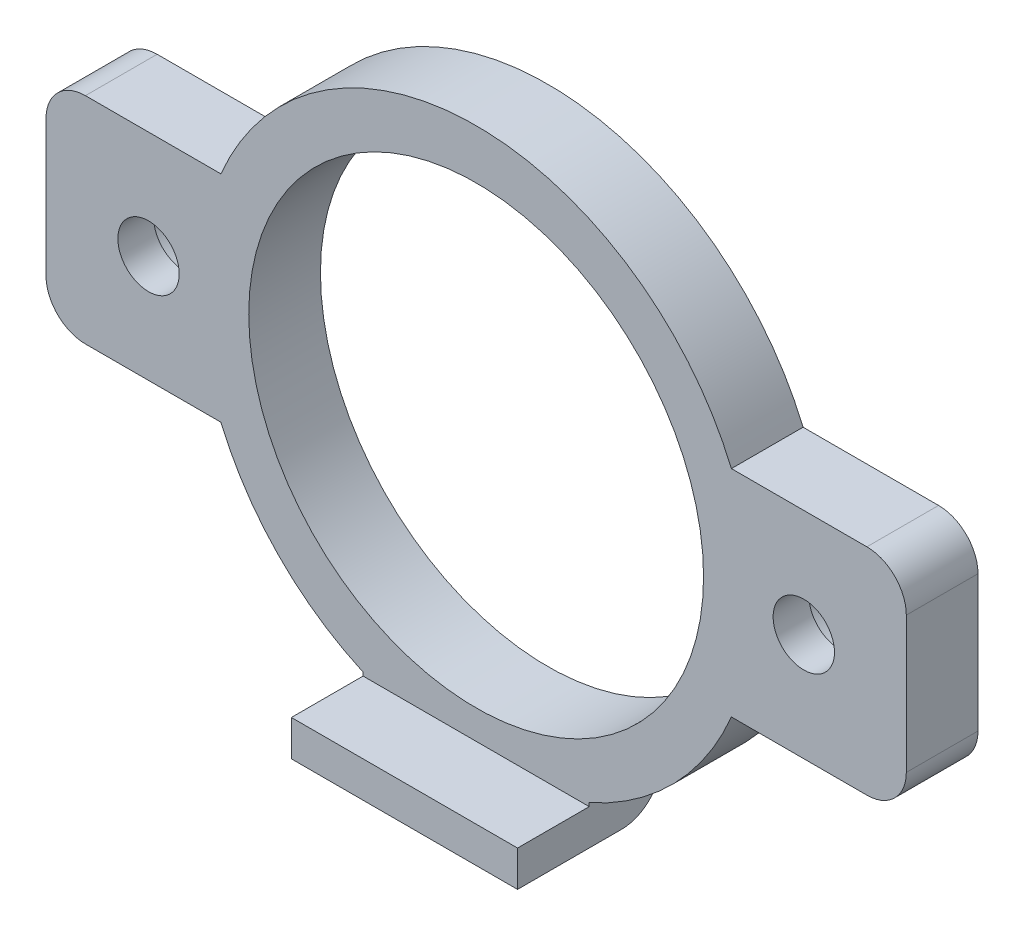
ISO-10303-21;
HEADER;
FILE_DESCRIPTION(('STEP AP214'),'2;1');
FILE_NAME('part.step','',(''),(''),'','','');
FILE_SCHEMA(('AUTOMOTIVE_DESIGN { 1 0 10303 214 1 1 1 1 }'));
ENDSEC;
DATA;
#1=APPLICATION_CONTEXT('core data for automotive mechanical design processes');
#2=APPLICATION_PROTOCOL_DEFINITION('international standard','automotive_design',2000,#1);
#3=PRODUCT_CONTEXT('',#1,'mechanical');
#4=PRODUCT('Part','Part','',(#3));
#5=PRODUCT_RELATED_PRODUCT_CATEGORY('part','',(#4));
#6=PRODUCT_DEFINITION_FORMATION('','',#4);
#7=PRODUCT_DEFINITION_CONTEXT('part definition',#1,'design');
#8=PRODUCT_DEFINITION('design','',#6,#7);
#9=PRODUCT_DEFINITION_SHAPE('','',#8);
#10=(LENGTH_UNIT() NAMED_UNIT(*) SI_UNIT(.MILLI.,.METRE.));
#11=(NAMED_UNIT(*) PLANE_ANGLE_UNIT() SI_UNIT($,.RADIAN.));
#12=(NAMED_UNIT(*) SI_UNIT($,.STERADIAN.) SOLID_ANGLE_UNIT());
#13=UNCERTAINTY_MEASURE_WITH_UNIT(LENGTH_MEASURE(1.E-05),#10,'distance_accuracy_value','');
#14=(GEOMETRIC_REPRESENTATION_CONTEXT(3) GLOBAL_UNCERTAINTY_ASSIGNED_CONTEXT((#13)) GLOBAL_UNIT_ASSIGNED_CONTEXT((#10,
#11,#12)) REPRESENTATION_CONTEXT('',''));
#15=CARTESIAN_POINT('',(0.,0.,0.));
#16=DIRECTION('',(0.,0.,1.));
#17=DIRECTION('',(1.,0.,0.));
#18=AXIS2_PLACEMENT_3D('',#15,#16,#17);
#19=CARTESIAN_POINT('',(0.,0.,0.));
#20=DIRECTION('',(0.,0.,1.));
#21=DIRECTION('',(1.,0.,0.));
#22=AXIS2_PLACEMENT_3D('',#19,#20,#21);
#23=PLANE('',#22);
#24=CARTESIAN_POINT('',(0.,0.,0.));
#25=DIRECTION('',(0.,0.,1.));
#26=DIRECTION('',(1.,0.,0.));
#27=AXIS2_PLACEMENT_3D('',#24,#25,#26);
#28=CIRCLE('',#27,6.34405594405594);
#29=CARTESIAN_POINT('',(6.34405594405594,0.,0.));
#30=VERTEX_POINT('',#29);
#31=EDGE_CURVE('E237',#30,#30,#28,.T.);
#32=ORIENTED_EDGE('',*,*,#31,.T.);
#33=EDGE_LOOP('',(#32));
#34=FACE_BOUND('',#33,.T.);
#35=DIRECTION('',(1.,0.,0.));
#36=VECTOR('',#35,1.);
#37=CARTESIAN_POINT('',(-12.,-3.,0.));
#38=LINE('',#37,#36);
#39=CARTESIAN_POINT('',(-10.9,-3.,0.));
#40=VERTEX_POINT('',#39);
#41=CARTESIAN_POINT('',(-7.1206643184094,-3.,0.));
#42=VERTEX_POINT('',#41);
#43=EDGE_CURVE('E315',#40,#42,#38,.T.);
#44=ORIENTED_EDGE('',*,*,#43,.F.);
#45=CARTESIAN_POINT('',(-10.9,-1.9,0.));
#46=DIRECTION('',(0.,0.,1.));
#47=DIRECTION('',(1.,0.,0.));
#48=AXIS2_PLACEMENT_3D('',#45,#46,#47);
#49=CIRCLE('',#48,1.1);
#50=CARTESIAN_POINT('',(-12.,-1.9,0.));
#51=VERTEX_POINT('',#50);
#52=EDGE_CURVE('E401',#40,#51,#49,.F.);
#53=ORIENTED_EDGE('',*,*,#52,.T.);
#54=DIRECTION('',(0.,-1.,0.));
#55=VECTOR('',#54,1.);
#56=CARTESIAN_POINT('',(-12.,3.,0.));
#57=LINE('',#56,#55);
#58=CARTESIAN_POINT('',(-12.,1.9,0.));
#59=VERTEX_POINT('',#58);
#60=EDGE_CURVE('E318',#59,#51,#57,.T.);
#61=ORIENTED_EDGE('',*,*,#60,.F.);
#62=CARTESIAN_POINT('',(-10.9,1.9,0.));
#63=DIRECTION('',(0.,0.,1.));
#64=DIRECTION('',(1.,0.,0.));
#65=AXIS2_PLACEMENT_3D('',#62,#63,#64);
#66=CIRCLE('',#65,1.1);
#67=CARTESIAN_POINT('',(-10.9,3.,0.));
#68=VERTEX_POINT('',#67);
#69=EDGE_CURVE('E398',#59,#68,#66,.F.);
#70=ORIENTED_EDGE('',*,*,#69,.T.);
#71=DIRECTION('',(1.,0.,0.));
#72=VECTOR('',#71,1.);
#73=CARTESIAN_POINT('',(-12.,3.,0.));
#74=LINE('',#73,#72);
#75=CARTESIAN_POINT('',(-7.1206643184094,3.,0.));
#76=VERTEX_POINT('',#75);
#77=EDGE_CURVE('E322',#68,#76,#74,.T.);
#78=ORIENTED_EDGE('',*,*,#77,.T.);
#79=CARTESIAN_POINT('',(0.,0.,0.));
#80=DIRECTION('',(0.,0.,1.));
#81=DIRECTION('',(1.,0.,0.));
#82=AXIS2_PLACEMENT_3D('',#79,#80,#81);
#83=CIRCLE('',#82,7.72682731368243);
#84=CARTESIAN_POINT('',(7.1206643184094,3.,0.));
#85=VERTEX_POINT('',#84);
#86=EDGE_CURVE('E325',#85,#76,#83,.T.);
#87=ORIENTED_EDGE('',*,*,#86,.F.);
#88=DIRECTION('',(-1.,0.,0.));
#89=VECTOR('',#88,1.);
#90=CARTESIAN_POINT('',(12.,3.,0.));
#91=LINE('',#90,#89);
#92=CARTESIAN_POINT('',(10.9,3.,0.));
#93=VERTEX_POINT('',#92);
#94=EDGE_CURVE('E329',#93,#85,#91,.T.);
#95=ORIENTED_EDGE('',*,*,#94,.F.);
#96=CARTESIAN_POINT('',(10.9,1.9,0.));
#97=DIRECTION('',(0.,0.,1.));
#98=DIRECTION('',(1.,0.,0.));
#99=AXIS2_PLACEMENT_3D('',#96,#97,#98);
#100=CIRCLE('',#99,1.1);
#101=CARTESIAN_POINT('',(12.,1.9,0.));
#102=VERTEX_POINT('',#101);
#103=EDGE_CURVE('E392',#93,#102,#100,.F.);
#104=ORIENTED_EDGE('',*,*,#103,.T.);
#105=DIRECTION('',(0.,-1.,0.));
#106=VECTOR('',#105,1.);
#107=CARTESIAN_POINT('',(12.,3.,0.));
#108=LINE('',#107,#106);
#109=CARTESIAN_POINT('',(12.,-1.9,0.));
#110=VERTEX_POINT('',#109);
#111=EDGE_CURVE('E332',#102,#110,#108,.T.);
#112=ORIENTED_EDGE('',*,*,#111,.T.);
#113=CARTESIAN_POINT('',(10.9,-1.9,0.));
#114=DIRECTION('',(0.,0.,1.));
#115=DIRECTION('',(1.,0.,0.));
#116=AXIS2_PLACEMENT_3D('',#113,#114,#115);
#117=CIRCLE('',#116,1.1);
#118=CARTESIAN_POINT('',(10.9,-3.,0.));
#119=VERTEX_POINT('',#118);
#120=EDGE_CURVE('E395',#110,#119,#117,.F.);
#121=ORIENTED_EDGE('',*,*,#120,.T.);
#122=DIRECTION('',(-1.,0.,0.));
#123=VECTOR('',#122,1.);
#124=CARTESIAN_POINT('',(12.,-3.,0.));
#125=LINE('',#124,#123);
#126=CARTESIAN_POINT('',(7.1206643184094,-3.,0.));
#127=VERTEX_POINT('',#126);
#128=EDGE_CURVE('E336',#119,#127,#125,.T.);
#129=ORIENTED_EDGE('',*,*,#128,.T.);
#130=CARTESIAN_POINT('',(0.,0.,0.));
#131=DIRECTION('',(0.,0.,1.));
#132=DIRECTION('',(1.,0.,0.));
#133=AXIS2_PLACEMENT_3D('',#130,#131,#132);
#134=CIRCLE('',#133,7.72682731368243);
#135=CARTESIAN_POINT('',(3.16249274077724,-7.05,0.));
#136=VERTEX_POINT('',#135);
#137=EDGE_CURVE('E339',#136,#127,#134,.T.);
#138=ORIENTED_EDGE('',*,*,#137,.F.);
#139=DIRECTION('',(-1.,0.,0.));
#140=VECTOR('',#139,1.);
#141=CARTESIAN_POINT('',(-3.15440313694085,-7.05,0.));
#142=LINE('',#141,#140);
#143=CARTESIAN_POINT('',(-3.16249274077724,-7.05,0.));
#144=VERTEX_POINT('',#143);
#145=EDGE_CURVE('E347',#136,#144,#142,.T.);
#146=ORIENTED_EDGE('',*,*,#145,.T.);
#147=CARTESIAN_POINT('',(0.,0.,0.));
#148=DIRECTION('',(0.,0.,1.));
#149=DIRECTION('',(1.,0.,0.));
#150=AXIS2_PLACEMENT_3D('',#147,#148,#149);
#151=CIRCLE('',#150,7.72682731368242);
#152=EDGE_CURVE('E311',#42,#144,#151,.T.);
#153=ORIENTED_EDGE('',*,*,#152,.F.);
#154=EDGE_LOOP('',(#44,#53,#61,#70,#78,#87,#95,#104,#112,#121,#129,#138,#146,#153));
#155=FACE_BOUND('',#154,.T.);
#156=CARTESIAN_POINT('',(-9.13997931467043,0.,0.));
#157=DIRECTION('',(0.,0.,1.));
#158=DIRECTION('',(1.,0.,0.));
#159=AXIS2_PLACEMENT_3D('',#156,#157,#158);
#160=CIRCLE('',#159,1.51048951048951);
#161=CARTESIAN_POINT('',(-7.62948980418092,0.,0.));
#162=VERTEX_POINT('',#161);
#163=EDGE_CURVE('E564',#162,#162,#160,.T.);
#164=ORIENTED_EDGE('',*,*,#163,.T.);
#165=EDGE_LOOP('',(#164));
#166=FACE_BOUND('',#165,.T.);
#167=CARTESIAN_POINT('',(9.13997931467043,0.,0.));
#168=DIRECTION('',(0.,0.,-1.));
#169=DIRECTION('',(-1.,0.,0.));
#170=AXIS2_PLACEMENT_3D('',#167,#168,#169);
#171=CIRCLE('',#170,1.51048951048951);
#172=CARTESIAN_POINT('',(7.62948980418092,0.,0.));
#173=VERTEX_POINT('',#172);
#174=EDGE_CURVE('E560',#173,#173,#171,.T.);
#175=ORIENTED_EDGE('',*,*,#174,.F.);
#176=EDGE_LOOP('',(#175));
#177=FACE_BOUND('',#176,.T.);
#178=ADVANCED_FACE('F80',(#34,#155,#166,#177),#23,.F.);
#179=CARTESIAN_POINT('',(9.13997931467043,0.,3.5));
#180=DIRECTION('',(0.,0.,-1.));
#181=DIRECTION('',(-1.,0.,0.));
#182=AXIS2_PLACEMENT_3D('',#179,#180,#181);
#183=CYLINDRICAL_SURFACE('',#182,0.855944055944055);
#184=CARTESIAN_POINT('',(9.13997931467043,0.,2.));
#185=DIRECTION('',(0.,0.,1.));
#186=DIRECTION('',(1.,0.,0.));
#187=AXIS2_PLACEMENT_3D('',#184,#185,#186);
#188=CIRCLE('',#187,0.855944055944055);
#189=CARTESIAN_POINT('',(9.99592337061449,0.,2.));
#190=VERTEX_POINT('',#189);
#191=EDGE_CURVE('E375',#190,#190,#188,.T.);
#192=ORIENTED_EDGE('',*,*,#191,.T.);
#193=EDGE_LOOP('',(#192));
#194=FACE_BOUND('',#193,.T.);
#195=CARTESIAN_POINT('',(9.13997931467043,0.,1.));
#196=DIRECTION('',(0.,0.,-1.));
#197=DIRECTION('',(-1.,0.,0.));
#198=AXIS2_PLACEMENT_3D('',#195,#196,#197);
#199=CIRCLE('',#198,0.855944055944055);
#200=CARTESIAN_POINT('',(8.28403525872638,0.,1.));
#201=VERTEX_POINT('',#200);
#202=EDGE_CURVE('E370',#201,#201,#199,.F.);
#203=ORIENTED_EDGE('',*,*,#202,.F.);
#204=EDGE_LOOP('',(#203));
#205=FACE_BOUND('',#204,.T.);
#206=ADVANCED_FACE('F511',(#194,#205),#183,.F.);
#207=CARTESIAN_POINT('',(0.,0.,2.));
#208=DIRECTION('',(0.,0.,1.));
#209=DIRECTION('',(1.,0.,0.));
#210=AXIS2_PLACEMENT_3D('',#207,#208,#209);
#211=PLANE('',#210);
#212=CARTESIAN_POINT('',(0.,0.,2.));
#213=DIRECTION('',(0.,0.,1.));
#214=DIRECTION('',(1.,0.,0.));
#215=AXIS2_PLACEMENT_3D('',#212,#213,#214);
#216=CIRCLE('',#215,6.34405594405594);
#217=CARTESIAN_POINT('',(6.34405594405594,0.,2.));
#218=VERTEX_POINT('',#217);
#219=EDGE_CURVE('E261',#218,#218,#216,.T.);
#220=ORIENTED_EDGE('',*,*,#219,.F.);
#221=EDGE_LOOP('',(#220));
#222=FACE_BOUND('',#221,.T.);
#223=DIRECTION('',(0.,-1.,0.));
#224=VECTOR('',#223,1.);
#225=CARTESIAN_POINT('',(-12.,3.,2.));
#226=LINE('',#225,#224);
#227=CARTESIAN_POINT('',(-12.,1.9,2.));
#228=VERTEX_POINT('',#227);
#229=CARTESIAN_POINT('',(-12.,-1.9,2.));
#230=VERTEX_POINT('',#229);
#231=EDGE_CURVE('E281',#228,#230,#226,.T.);
#232=ORIENTED_EDGE('',*,*,#231,.T.);
#233=CARTESIAN_POINT('',(-10.9,-1.9,2.));
#234=DIRECTION('',(0.,0.,1.));
#235=DIRECTION('',(1.,0.,0.));
#236=AXIS2_PLACEMENT_3D('',#233,#234,#235);
#237=CIRCLE('',#236,1.1);
#238=CARTESIAN_POINT('',(-10.9,-3.,2.));
#239=VERTEX_POINT('',#238);
#240=EDGE_CURVE('E419',#230,#239,#237,.T.);
#241=ORIENTED_EDGE('',*,*,#240,.T.);
#242=DIRECTION('',(1.,0.,0.));
#243=VECTOR('',#242,1.);
#244=CARTESIAN_POINT('',(-12.,-3.,2.));
#245=LINE('',#244,#243);
#246=CARTESIAN_POINT('',(-7.1206643184094,-3.,2.));
#247=VERTEX_POINT('',#246);
#248=EDGE_CURVE('E278',#239,#247,#245,.T.);
#249=ORIENTED_EDGE('',*,*,#248,.T.);
#250=CARTESIAN_POINT('',(0.,0.,2.));
#251=DIRECTION('',(0.,0.,1.));
#252=DIRECTION('',(1.,0.,0.));
#253=AXIS2_PLACEMENT_3D('',#250,#251,#252);
#254=CIRCLE('',#253,7.72682731368242);
#255=CARTESIAN_POINT('',(-3.15440313694085,-7.05362326645863,2.));
#256=VERTEX_POINT('',#255);
#257=EDGE_CURVE('E275',#247,#256,#254,.T.);
#258=ORIENTED_EDGE('',*,*,#257,.T.);
#259=DIRECTION('',(0.,-1.,0.));
#260=VECTOR('',#259,1.);
#261=CARTESIAN_POINT('',(-3.15440313694085,-7.05362326645863,2.));
#262=LINE('',#261,#260);
#263=CARTESIAN_POINT('',(-3.15440313694085,-7.15,2.));
#264=VERTEX_POINT('',#263);
#265=EDGE_CURVE('E271',#256,#264,#262,.T.);
#266=ORIENTED_EDGE('',*,*,#265,.T.);
#267=DIRECTION('',(-1.,0.,0.));
#268=VECTOR('',#267,1.);
#269=CARTESIAN_POINT('',(3.15440313694085,-7.15,2.));
#270=LINE('',#269,#268);
#271=CARTESIAN_POINT('',(3.15440313694085,-7.15,2.));
#272=VERTEX_POINT('',#271);
#273=EDGE_CURVE('E233',#272,#264,#270,.T.);
#274=ORIENTED_EDGE('',*,*,#273,.F.);
#275=DIRECTION('',(0.,-1.,0.));
#276=VECTOR('',#275,1.);
#277=CARTESIAN_POINT('',(3.15440313694085,-7.05362326645863,2.));
#278=LINE('',#277,#276);
#279=CARTESIAN_POINT('',(3.15440313694085,-7.05362326645863,2.));
#280=VERTEX_POINT('',#279);
#281=EDGE_CURVE('E306',#280,#272,#278,.T.);
#282=ORIENTED_EDGE('',*,*,#281,.F.);
#283=CARTESIAN_POINT('',(0.,0.,2.));
#284=DIRECTION('',(0.,0.,1.));
#285=DIRECTION('',(1.,0.,0.));
#286=AXIS2_PLACEMENT_3D('',#283,#284,#285);
#287=CIRCLE('',#286,7.72682731368243);
#288=CARTESIAN_POINT('',(7.1206643184094,-3.,2.));
#289=VERTEX_POINT('',#288);
#290=EDGE_CURVE('E302',#280,#289,#287,.T.);
#291=ORIENTED_EDGE('',*,*,#290,.T.);
#292=DIRECTION('',(-1.,0.,0.));
#293=VECTOR('',#292,1.);
#294=CARTESIAN_POINT('',(12.,-3.,2.));
#295=LINE('',#294,#293);
#296=CARTESIAN_POINT('',(10.9,-3.,2.));
#297=VERTEX_POINT('',#296);
#298=EDGE_CURVE('E299',#297,#289,#295,.T.);
#299=ORIENTED_EDGE('',*,*,#298,.F.);
#300=CARTESIAN_POINT('',(10.9,-1.9,2.));
#301=DIRECTION('',(0.,0.,1.));
#302=DIRECTION('',(1.,0.,0.));
#303=AXIS2_PLACEMENT_3D('',#300,#301,#302);
#304=CIRCLE('',#303,1.1);
#305=CARTESIAN_POINT('',(12.,-1.9,2.));
#306=VERTEX_POINT('',#305);
#307=EDGE_CURVE('E413',#297,#306,#304,.T.);
#308=ORIENTED_EDGE('',*,*,#307,.T.);
#309=DIRECTION('',(0.,-1.,0.));
#310=VECTOR('',#309,1.);
#311=CARTESIAN_POINT('',(12.,3.,2.));
#312=LINE('',#311,#310);
#313=CARTESIAN_POINT('',(12.,1.9,2.));
#314=VERTEX_POINT('',#313);
#315=EDGE_CURVE('E295',#314,#306,#312,.T.);
#316=ORIENTED_EDGE('',*,*,#315,.F.);
#317=CARTESIAN_POINT('',(10.9,1.9,2.));
#318=DIRECTION('',(0.,0.,1.));
#319=DIRECTION('',(1.,0.,0.));
#320=AXIS2_PLACEMENT_3D('',#317,#318,#319);
#321=CIRCLE('',#320,1.1);
#322=CARTESIAN_POINT('',(10.9,3.,2.));
#323=VERTEX_POINT('',#322);
#324=EDGE_CURVE('E104',#314,#323,#321,.T.);
#325=ORIENTED_EDGE('',*,*,#324,.T.);
#326=DIRECTION('',(-1.,0.,0.));
#327=VECTOR('',#326,1.);
#328=CARTESIAN_POINT('',(12.,3.,2.));
#329=LINE('',#328,#327);
#330=CARTESIAN_POINT('',(7.1206643184094,3.,2.));
#331=VERTEX_POINT('',#330);
#332=EDGE_CURVE('E292',#323,#331,#329,.T.);
#333=ORIENTED_EDGE('',*,*,#332,.T.);
#334=CARTESIAN_POINT('',(0.,0.,2.));
#335=DIRECTION('',(0.,0.,1.));
#336=DIRECTION('',(1.,0.,0.));
#337=AXIS2_PLACEMENT_3D('',#334,#335,#336);
#338=CIRCLE('',#337,7.72682731368243);
#339=CARTESIAN_POINT('',(-7.1206643184094,3.,2.));
#340=VERTEX_POINT('',#339);
#341=EDGE_CURVE('E288',#331,#340,#338,.T.);
#342=ORIENTED_EDGE('',*,*,#341,.T.);
#343=DIRECTION('',(1.,0.,0.));
#344=VECTOR('',#343,1.);
#345=CARTESIAN_POINT('',(-12.,3.,2.));
#346=LINE('',#345,#344);
#347=CARTESIAN_POINT('',(-10.9,3.,2.));
#348=VERTEX_POINT('',#347);
#349=EDGE_CURVE('E285',#348,#340,#346,.T.);
#350=ORIENTED_EDGE('',*,*,#349,.F.);
#351=CARTESIAN_POINT('',(-10.9,1.9,2.));
#352=DIRECTION('',(0.,0.,1.));
#353=DIRECTION('',(1.,0.,0.));
#354=AXIS2_PLACEMENT_3D('',#351,#352,#353);
#355=CIRCLE('',#354,1.1);
#356=EDGE_CURVE('E416',#348,#228,#355,.T.);
#357=ORIENTED_EDGE('',*,*,#356,.T.);
#358=EDGE_LOOP('',(#232,#241,#249,#258,#266,#274,#282,#291,#299,#308,#316,#325,#333,#342,#350,#357));
#359=FACE_BOUND('',#358,.T.);
#360=ORIENTED_EDGE('',*,*,#191,.F.);
#361=EDGE_LOOP('',(#360));
#362=FACE_BOUND('',#361,.T.);
#363=CARTESIAN_POINT('',(-9.13997931467043,0.,2.));
#364=DIRECTION('',(0.,0.,1.));
#365=DIRECTION('',(1.,0.,0.));
#366=AXIS2_PLACEMENT_3D('',#363,#364,#365);
#367=CIRCLE('',#366,0.855944055944055);
#368=CARTESIAN_POINT('',(-8.28403525872638,0.,2.));
#369=VERTEX_POINT('',#368);
#370=EDGE_CURVE('E227',#369,#369,#367,.F.);
#371=ORIENTED_EDGE('',*,*,#370,.T.);
#372=EDGE_LOOP('',(#371));
#373=FACE_BOUND('',#372,.T.);
#374=ADVANCED_FACE('F438',(#222,#359,#362,#373),#211,.T.);
#375=CARTESIAN_POINT('',(3.15440313694085,-7.05362326645863,2.));
#376=DIRECTION('',(1.,0.,0.));
#377=DIRECTION('',(0.,0.,-1.));
#378=AXIS2_PLACEMENT_3D('',#375,#376,#377);
#379=PLANE('',#378);
#380=DIRECTION('',(0.,0.,-1.));
#381=VECTOR('',#380,1.);
#382=CARTESIAN_POINT('',(3.15440313694085,-8.15,4.));
#383=LINE('',#382,#381);
#384=CARTESIAN_POINT('',(3.15440313694085,-8.15,4.));
#385=VERTEX_POINT('',#384);
#386=CARTESIAN_POINT('',(3.15440313694085,-8.15,1.1));
#387=VERTEX_POINT('',#386);
#388=EDGE_CURVE('E255',#385,#387,#383,.T.);
#389=ORIENTED_EDGE('',*,*,#388,.T.);
#390=CARTESIAN_POINT('',(3.15440313694085,-7.05,1.1));
#391=DIRECTION('',(1.,0.,0.));
#392=DIRECTION('',(0.,0.,-1.));
#393=AXIS2_PLACEMENT_3D('',#390,#391,#392);
#394=CIRCLE('',#393,1.1);
#395=CARTESIAN_POINT('',(3.15440313694085,-7.05362326645863,0.));
#396=VERTEX_POINT('',#395);
#397=EDGE_CURVE('E385',#387,#396,#394,.T.);
#398=ORIENTED_EDGE('',*,*,#397,.T.);
#399=DIRECTION('',(0.,0.,-1.));
#400=VECTOR('',#399,1.);
#401=CARTESIAN_POINT('',(3.15440313694085,-7.05362326645863,2.));
#402=LINE('',#401,#400);
#403=EDGE_CURVE('E343',#280,#396,#402,.T.);
#404=ORIENTED_EDGE('',*,*,#403,.F.);
#405=ORIENTED_EDGE('',*,*,#281,.T.);
#406=DIRECTION('',(0.,0.,-1.));
#407=VECTOR('',#406,1.);
#408=CARTESIAN_POINT('',(3.15440313694085,-7.15,4.));
#409=LINE('',#408,#407);
#410=CARTESIAN_POINT('',(3.15440313694085,-7.15,4.));
#411=VERTEX_POINT('',#410);
#412=EDGE_CURVE('E252',#411,#272,#409,.T.);
#413=ORIENTED_EDGE('',*,*,#412,.F.);
#414=DIRECTION('',(0.,-1.,0.));
#415=VECTOR('',#414,1.);
#416=CARTESIAN_POINT('',(3.15440313694085,-7.15,4.));
#417=LINE('',#416,#415);
#418=EDGE_CURVE('E223',#411,#385,#417,.T.);
#419=ORIENTED_EDGE('',*,*,#418,.T.);
#420=EDGE_LOOP('',(#389,#398,#404,#405,#413,#419));
#421=FACE_BOUND('',#420,.T.);
#422=ADVANCED_FACE('F496',(#421),#379,.T.);
#423=CARTESIAN_POINT('',(0.,0.,2.));
#424=DIRECTION('',(0.,0.,-1.));
#425=DIRECTION('',(-1.,0.,0.));
#426=AXIS2_PLACEMENT_3D('',#423,#424,#425);
#427=CYLINDRICAL_SURFACE('',#426,7.72682731368243);
#428=EDGE_CURVE('E272',#396,#136,#134,.T.);
#429=ORIENTED_EDGE('',*,*,#428,.T.);
#430=ORIENTED_EDGE('',*,*,#137,.T.);
#431=DIRECTION('',(0.,0.,-1.));
#432=VECTOR('',#431,1.);
#433=CARTESIAN_POINT('',(7.1206643184094,-3.,2.));
#434=LINE('',#433,#432);
#435=EDGE_CURVE('E348',#289,#127,#434,.T.);
#436=ORIENTED_EDGE('',*,*,#435,.F.);
#437=ORIENTED_EDGE('',*,*,#290,.F.);
#438=ORIENTED_EDGE('',*,*,#403,.T.);
#439=EDGE_LOOP('',(#429,#430,#436,#437,#438));
#440=FACE_BOUND('',#439,.T.);
#441=ADVANCED_FACE('F498',(#440),#427,.T.);
#442=CARTESIAN_POINT('',(12.,-3.,2.));
#443=DIRECTION('',(0.,-1.,0.));
#444=DIRECTION('',(1.,0.,0.));
#445=AXIS2_PLACEMENT_3D('',#442,#443,#444);
#446=PLANE('',#445);
#447=ORIENTED_EDGE('',*,*,#128,.F.);
#448=DIRECTION('',(0.,0.,-1.));
#449=VECTOR('',#448,1.);
#450=CARTESIAN_POINT('',(10.9,-3.,2.));
#451=LINE('',#450,#449);
#452=EDGE_CURVE('E89',#119,#297,#451,.F.);
#453=ORIENTED_EDGE('',*,*,#452,.T.);
#454=ORIENTED_EDGE('',*,*,#298,.T.);
#455=ORIENTED_EDGE('',*,*,#435,.T.);
#456=EDGE_LOOP('',(#447,#453,#454,#455));
#457=FACE_BOUND('',#456,.T.);
#458=ADVANCED_FACE('F435',(#457),#446,.T.);
#459=CARTESIAN_POINT('',(12.,3.,2.));
#460=DIRECTION('',(1.,0.,0.));
#461=DIRECTION('',(0.,0.,-1.));
#462=AXIS2_PLACEMENT_3D('',#459,#460,#461);
#463=PLANE('',#462);
#464=ORIENTED_EDGE('',*,*,#315,.T.);
#465=DIRECTION('',(0.,0.,-1.));
#466=VECTOR('',#465,1.);
#467=CARTESIAN_POINT('',(12.,-1.9,2.));
#468=LINE('',#467,#466);
#469=EDGE_CURVE('E427',#306,#110,#468,.T.);
#470=ORIENTED_EDGE('',*,*,#469,.T.);
#471=ORIENTED_EDGE('',*,*,#111,.F.);
#472=DIRECTION('',(0.,0.,-1.));
#473=VECTOR('',#472,1.);
#474=CARTESIAN_POINT('',(12.,1.9,2.));
#475=LINE('',#474,#473);
#476=EDGE_CURVE('E424',#102,#314,#475,.F.);
#477=ORIENTED_EDGE('',*,*,#476,.T.);
#478=EDGE_LOOP('',(#464,#470,#471,#477));
#479=FACE_BOUND('',#478,.T.);
#480=ADVANCED_FACE('F447',(#479),#463,.T.);
#481=CARTESIAN_POINT('',(12.,3.,2.));
#482=DIRECTION('',(0.,-1.,0.));
#483=DIRECTION('',(1.,0.,0.));
#484=AXIS2_PLACEMENT_3D('',#481,#482,#483);
#485=PLANE('',#484);
#486=ORIENTED_EDGE('',*,*,#332,.F.);
#487=DIRECTION('',(0.,0.,-1.));
#488=VECTOR('',#487,1.);
#489=CARTESIAN_POINT('',(10.9,3.,0.));
#490=LINE('',#489,#488);
#491=EDGE_CURVE('E12',#323,#93,#490,.T.);
#492=ORIENTED_EDGE('',*,*,#491,.T.);
#493=ORIENTED_EDGE('',*,*,#94,.T.);
#494=DIRECTION('',(0.,0.,-1.));
#495=VECTOR('',#494,1.);
#496=CARTESIAN_POINT('',(7.1206643184094,3.,2.));
#497=LINE('',#496,#495);
#498=EDGE_CURVE('E352',#331,#85,#497,.T.);
#499=ORIENTED_EDGE('',*,*,#498,.F.);
#500=EDGE_LOOP('',(#486,#492,#493,#499));
#501=FACE_BOUND('',#500,.T.);
#502=ADVANCED_FACE('F457',(#501),#485,.F.);
#503=CARTESIAN_POINT('',(0.,0.,2.));
#504=DIRECTION('',(0.,0.,-1.));
#505=DIRECTION('',(-1.,0.,0.));
#506=AXIS2_PLACEMENT_3D('',#503,#504,#505);
#507=CYLINDRICAL_SURFACE('',#506,7.72682731368243);
#508=ORIENTED_EDGE('',*,*,#86,.T.);
#509=DIRECTION('',(0.,0.,-1.));
#510=VECTOR('',#509,1.);
#511=CARTESIAN_POINT('',(-7.1206643184094,3.,2.));
#512=LINE('',#511,#510);
#513=EDGE_CURVE('E356',#340,#76,#512,.T.);
#514=ORIENTED_EDGE('',*,*,#513,.F.);
#515=ORIENTED_EDGE('',*,*,#341,.F.);
#516=ORIENTED_EDGE('',*,*,#498,.T.);
#517=EDGE_LOOP('',(#508,#514,#515,#516));
#518=FACE_BOUND('',#517,.T.);
#519=ADVANCED_FACE('F463',(#518),#507,.T.);
#520=CARTESIAN_POINT('',(-12.,3.,2.));
#521=DIRECTION('',(0.,1.,0.));
#522=DIRECTION('',(-1.,0.,0.));
#523=AXIS2_PLACEMENT_3D('',#520,#521,#522);
#524=PLANE('',#523);
#525=ORIENTED_EDGE('',*,*,#77,.F.);
#526=DIRECTION('',(0.,0.,-1.));
#527=VECTOR('',#526,1.);
#528=CARTESIAN_POINT('',(-10.9,3.,2.));
#529=LINE('',#528,#527);
#530=EDGE_CURVE('E96',#68,#348,#529,.F.);
#531=ORIENTED_EDGE('',*,*,#530,.T.);
#532=ORIENTED_EDGE('',*,*,#349,.T.);
#533=ORIENTED_EDGE('',*,*,#513,.T.);
#534=EDGE_LOOP('',(#525,#531,#532,#533));
#535=FACE_BOUND('',#534,.T.);
#536=ADVANCED_FACE('F464',(#535),#524,.T.);
#537=CARTESIAN_POINT('',(-12.,3.,2.));
#538=DIRECTION('',(1.,0.,0.));
#539=DIRECTION('',(0.,0.,-1.));
#540=AXIS2_PLACEMENT_3D('',#537,#538,#539);
#541=PLANE('',#540);
#542=ORIENTED_EDGE('',*,*,#60,.T.);
#543=DIRECTION('',(0.,0.,-1.));
#544=VECTOR('',#543,1.);
#545=CARTESIAN_POINT('',(-12.,-1.9,2.));
#546=LINE('',#545,#544);
#547=EDGE_CURVE('E408',#51,#230,#546,.F.);
#548=ORIENTED_EDGE('',*,*,#547,.T.);
#549=ORIENTED_EDGE('',*,*,#231,.F.);
#550=DIRECTION('',(0.,0.,-1.));
#551=VECTOR('',#550,1.);
#552=CARTESIAN_POINT('',(-12.,1.9,0.));
#553=LINE('',#552,#551);
#554=EDGE_CURVE('E404',#228,#59,#553,.T.);
#555=ORIENTED_EDGE('',*,*,#554,.T.);
#556=EDGE_LOOP('',(#542,#548,#549,#555));
#557=FACE_BOUND('',#556,.T.);
#558=ADVANCED_FACE('F471',(#557),#541,.F.);
#559=CARTESIAN_POINT('',(-12.,-3.,2.));
#560=DIRECTION('',(0.,1.,0.));
#561=DIRECTION('',(-1.,0.,0.));
#562=AXIS2_PLACEMENT_3D('',#559,#560,#561);
#563=PLANE('',#562);
#564=ORIENTED_EDGE('',*,*,#248,.F.);
#565=DIRECTION('',(0.,0.,-1.));
#566=VECTOR('',#565,1.);
#567=CARTESIAN_POINT('',(-10.9,-3.,2.));
#568=LINE('',#567,#566);
#569=EDGE_CURVE('E388',#239,#40,#568,.T.);
#570=ORIENTED_EDGE('',*,*,#569,.T.);
#571=ORIENTED_EDGE('',*,*,#43,.T.);
#572=DIRECTION('',(0.,0.,-1.));
#573=VECTOR('',#572,1.);
#574=CARTESIAN_POINT('',(-7.1206643184094,-3.,2.));
#575=LINE('',#574,#573);
#576=EDGE_CURVE('E360',#247,#42,#575,.T.);
#577=ORIENTED_EDGE('',*,*,#576,.F.);
#578=EDGE_LOOP('',(#564,#570,#571,#577));
#579=FACE_BOUND('',#578,.T.);
#580=ADVANCED_FACE('F480',(#579),#563,.F.);
#581=CARTESIAN_POINT('',(0.,0.,2.));
#582=DIRECTION('',(0.,0.,-1.));
#583=DIRECTION('',(-1.,0.,0.));
#584=AXIS2_PLACEMENT_3D('',#581,#582,#583);
#585=CYLINDRICAL_SURFACE('',#584,7.72682731368242);
#586=ORIENTED_EDGE('',*,*,#152,.T.);
#587=CARTESIAN_POINT('',(-3.15440313694085,-7.05362326645863,0.));
#588=VERTEX_POINT('',#587);
#589=EDGE_CURVE('E265',#144,#588,#151,.T.);
#590=ORIENTED_EDGE('',*,*,#589,.T.);
#591=DIRECTION('',(0.,0.,-1.));
#592=VECTOR('',#591,1.);
#593=CARTESIAN_POINT('',(-3.15440313694085,-7.05362326645863,2.));
#594=LINE('',#593,#592);
#595=EDGE_CURVE('E310',#256,#588,#594,.T.);
#596=ORIENTED_EDGE('',*,*,#595,.F.);
#597=ORIENTED_EDGE('',*,*,#257,.F.);
#598=ORIENTED_EDGE('',*,*,#576,.T.);
#599=EDGE_LOOP('',(#586,#590,#596,#597,#598));
#600=FACE_BOUND('',#599,.T.);
#601=ADVANCED_FACE('F485',(#600),#585,.T.);
#602=CARTESIAN_POINT('',(-3.15440313694085,-7.05362326645863,2.));
#603=DIRECTION('',(1.,0.,0.));
#604=DIRECTION('',(0.,0.,-1.));
#605=AXIS2_PLACEMENT_3D('',#602,#603,#604);
#606=PLANE('',#605);
#607=ORIENTED_EDGE('',*,*,#595,.T.);
#608=CARTESIAN_POINT('',(-3.15440313694085,-7.05,1.1));
#609=DIRECTION('',(1.,0.,0.));
#610=DIRECTION('',(0.,0.,-1.));
#611=AXIS2_PLACEMENT_3D('',#608,#609,#610);
#612=CIRCLE('',#611,1.1);
#613=CARTESIAN_POINT('',(-3.15440313694085,-8.15,1.1));
#614=VERTEX_POINT('',#613);
#615=EDGE_CURVE('E379',#588,#614,#612,.F.);
#616=ORIENTED_EDGE('',*,*,#615,.T.);
#617=DIRECTION('',(0.,0.,-1.));
#618=VECTOR('',#617,1.);
#619=CARTESIAN_POINT('',(-3.15440313694085,-8.15,4.));
#620=LINE('',#619,#618);
#621=CARTESIAN_POINT('',(-3.15440313694085,-8.15,4.));
#622=VERTEX_POINT('',#621);
#623=EDGE_CURVE('E238',#622,#614,#620,.T.);
#624=ORIENTED_EDGE('',*,*,#623,.F.);
#625=DIRECTION('',(0.,1.,0.));
#626=VECTOR('',#625,1.);
#627=CARTESIAN_POINT('',(-3.15440313694085,-8.15,4.));
#628=LINE('',#627,#626);
#629=CARTESIAN_POINT('',(-3.15440313694085,-7.15,4.));
#630=VERTEX_POINT('',#629);
#631=EDGE_CURVE('E220',#622,#630,#628,.T.);
#632=ORIENTED_EDGE('',*,*,#631,.T.);
#633=DIRECTION('',(0.,0.,-1.));
#634=VECTOR('',#633,1.);
#635=CARTESIAN_POINT('',(-3.15440313694085,-7.15,4.));
#636=LINE('',#635,#634);
#637=EDGE_CURVE('E231',#630,#264,#636,.T.);
#638=ORIENTED_EDGE('',*,*,#637,.T.);
#639=ORIENTED_EDGE('',*,*,#265,.F.);
#640=EDGE_LOOP('',(#607,#616,#624,#632,#638,#639));
#641=FACE_BOUND('',#640,.T.);
#642=ADVANCED_FACE('F241',(#641),#606,.F.);
#643=CARTESIAN_POINT('',(0.,0.,2.));
#644=DIRECTION('',(0.,0.,-1.));
#645=DIRECTION('',(-1.,0.,0.));
#646=AXIS2_PLACEMENT_3D('',#643,#644,#645);
#647=CYLINDRICAL_SURFACE('',#646,6.34405594405594);
#648=ORIENTED_EDGE('',*,*,#219,.T.);
#649=EDGE_LOOP('',(#648));
#650=FACE_BOUND('',#649,.T.);
#651=ORIENTED_EDGE('',*,*,#31,.F.);
#652=EDGE_LOOP('',(#651));
#653=FACE_BOUND('',#652,.T.);
#654=ADVANCED_FACE('F523',(#650,#653),#647,.F.);
#655=CARTESIAN_POINT('',(3.15440313694085,-7.15,4.));
#656=DIRECTION('',(0.,-1.,0.));
#657=DIRECTION('',(1.,0.,0.));
#658=AXIS2_PLACEMENT_3D('',#655,#656,#657);
#659=PLANE('',#658);
#660=ORIENTED_EDGE('',*,*,#412,.T.);
#661=ORIENTED_EDGE('',*,*,#273,.T.);
#662=ORIENTED_EDGE('',*,*,#637,.F.);
#663=DIRECTION('',(-1.,0.,0.));
#664=VECTOR('',#663,1.);
#665=CARTESIAN_POINT('',(3.15440313694085,-7.15,4.));
#666=LINE('',#665,#664);
#667=EDGE_CURVE('E215',#411,#630,#666,.T.);
#668=ORIENTED_EDGE('',*,*,#667,.F.);
#669=EDGE_LOOP('',(#660,#661,#662,#668));
#670=FACE_BOUND('',#669,.T.);
#671=ADVANCED_FACE('F232',(#670),#659,.F.);
#672=CARTESIAN_POINT('',(3.15440313694085,-8.15,4.));
#673=DIRECTION('',(0.,-1.,0.));
#674=DIRECTION('',(0.,0.,-1.));
#675=AXIS2_PLACEMENT_3D('',#672,#673,#674);
#676=PLANE('',#675);
#677=ORIENTED_EDGE('',*,*,#623,.T.);
#678=DIRECTION('',(-1.,0.,0.));
#679=VECTOR('',#678,1.);
#680=CARTESIAN_POINT('',(3.15440313694085,-8.15,1.1));
#681=LINE('',#680,#679);
#682=EDGE_CURVE('E382',#614,#387,#681,.F.);
#683=ORIENTED_EDGE('',*,*,#682,.T.);
#684=ORIENTED_EDGE('',*,*,#388,.F.);
#685=DIRECTION('',(-1.,0.,0.));
#686=VECTOR('',#685,1.);
#687=CARTESIAN_POINT('',(3.15440313694085,-8.15,4.));
#688=LINE('',#687,#686);
#689=EDGE_CURVE('E244',#385,#622,#688,.T.);
#690=ORIENTED_EDGE('',*,*,#689,.T.);
#691=EDGE_LOOP('',(#677,#683,#684,#690));
#692=FACE_BOUND('',#691,.T.);
#693=ADVANCED_FACE('F494',(#692),#676,.T.);
#694=CARTESIAN_POINT('',(0.,0.,4.));
#695=DIRECTION('',(0.,0.,-1.));
#696=DIRECTION('',(-1.,0.,0.));
#697=AXIS2_PLACEMENT_3D('',#694,#695,#696);
#698=PLANE('',#697);
#699=ORIENTED_EDGE('',*,*,#667,.T.);
#700=ORIENTED_EDGE('',*,*,#631,.F.);
#701=ORIENTED_EDGE('',*,*,#689,.F.);
#702=ORIENTED_EDGE('',*,*,#418,.F.);
#703=EDGE_LOOP('',(#699,#700,#701,#702));
#704=FACE_BOUND('',#703,.T.);
#705=ADVANCED_FACE('F217',(#704),#698,.F.);
#706=CARTESIAN_POINT('',(-9.13997931467043,0.,3.5));
#707=DIRECTION('',(0.,0.,-1.));
#708=DIRECTION('',(-1.,0.,0.));
#709=AXIS2_PLACEMENT_3D('',#706,#707,#708);
#710=CYLINDRICAL_SURFACE('',#709,0.855944055944055);
#711=CARTESIAN_POINT('',(-9.13997931467043,0.,1.));
#712=DIRECTION('',(0.,0.,1.));
#713=DIRECTION('',(1.,0.,0.));
#714=AXIS2_PLACEMENT_3D('',#711,#712,#713);
#715=CIRCLE('',#714,0.855944055944055);
#716=CARTESIAN_POINT('',(-8.28403525872638,0.,1.));
#717=VERTEX_POINT('',#716);
#718=EDGE_CURVE('E366',#717,#717,#715,.T.);
#719=ORIENTED_EDGE('',*,*,#718,.F.);
#720=EDGE_LOOP('',(#719));
#721=FACE_BOUND('',#720,.T.);
#722=ORIENTED_EDGE('',*,*,#370,.F.);
#723=EDGE_LOOP('',(#722));
#724=FACE_BOUND('',#723,.T.);
#725=ADVANCED_FACE('F532',(#721,#724),#710,.F.);
#726=CARTESIAN_POINT('',(-9.13997931467043,0.,1.));
#727=DIRECTION('',(0.,0.,-1.));
#728=DIRECTION('',(-1.,0.,0.));
#729=AXIS2_PLACEMENT_3D('',#726,#727,#728);
#730=CYLINDRICAL_SURFACE('',#729,1.51048951048951);
#731=CARTESIAN_POINT('',(-9.13997931467043,0.,1.));
#732=DIRECTION('',(0.,0.,1.));
#733=DIRECTION('',(1.,0.,0.));
#734=AXIS2_PLACEMENT_3D('',#731,#732,#733);
#735=CIRCLE('',#734,1.51048951048951);
#736=CARTESIAN_POINT('',(-7.62948980418092,0.,1.));
#737=VERTEX_POINT('',#736);
#738=EDGE_CURVE('E570',#737,#737,#735,.T.);
#739=ORIENTED_EDGE('',*,*,#738,.T.);
#740=EDGE_LOOP('',(#739));
#741=FACE_BOUND('',#740,.T.);
#742=ORIENTED_EDGE('',*,*,#163,.F.);
#743=EDGE_LOOP('',(#742));
#744=FACE_BOUND('',#743,.T.);
#745=ADVANCED_FACE('F536',(#741,#744),#730,.F.);
#746=CARTESIAN_POINT('',(-9.13997931467043,0.,1.));
#747=DIRECTION('',(0.,0.,1.));
#748=DIRECTION('',(1.,0.,0.));
#749=AXIS2_PLACEMENT_3D('',#746,#747,#748);
#750=PLANE('',#749);
#751=ORIENTED_EDGE('',*,*,#718,.T.);
#752=EDGE_LOOP('',(#751));
#753=FACE_BOUND('',#752,.T.);
#754=ORIENTED_EDGE('',*,*,#738,.F.);
#755=EDGE_LOOP('',(#754));
#756=FACE_BOUND('',#755,.T.);
#757=ADVANCED_FACE('F538',(#753,#756),#750,.F.);
#758=CARTESIAN_POINT('',(9.13997931467043,0.,1.));
#759=DIRECTION('',(0.,0.,-1.));
#760=DIRECTION('',(-1.,0.,0.));
#761=AXIS2_PLACEMENT_3D('',#758,#759,#760);
#762=PLANE('',#761);
#763=CARTESIAN_POINT('',(9.13997931467043,0.,1.));
#764=DIRECTION('',(0.,0.,-1.));
#765=DIRECTION('',(-1.,0.,0.));
#766=AXIS2_PLACEMENT_3D('',#763,#764,#765);
#767=CIRCLE('',#766,1.51048951048951);
#768=CARTESIAN_POINT('',(7.62948980418092,0.,1.));
#769=VERTEX_POINT('',#768);
#770=EDGE_CURVE('E371',#769,#769,#767,.T.);
#771=ORIENTED_EDGE('',*,*,#770,.T.);
#772=EDGE_LOOP('',(#771));
#773=FACE_BOUND('',#772,.T.);
#774=ORIENTED_EDGE('',*,*,#202,.T.);
#775=EDGE_LOOP('',(#774));
#776=FACE_BOUND('',#775,.T.);
#777=ADVANCED_FACE('F541',(#773,#776),#762,.T.);
#778=CARTESIAN_POINT('',(9.13997931467043,0.,1.));
#779=DIRECTION('',(0.,0.,-1.));
#780=DIRECTION('',(-1.,0.,0.));
#781=AXIS2_PLACEMENT_3D('',#778,#779,#780);
#782=CYLINDRICAL_SURFACE('',#781,1.51048951048951);
#783=ORIENTED_EDGE('',*,*,#770,.F.);
#784=EDGE_LOOP('',(#783));
#785=FACE_BOUND('',#784,.T.);
#786=ORIENTED_EDGE('',*,*,#174,.T.);
#787=EDGE_LOOP('',(#786));
#788=FACE_BOUND('',#787,.T.);
#789=ADVANCED_FACE('F546',(#785,#788),#782,.F.);
#790=CARTESIAN_POINT('',(0.,-7.05,1.1));
#791=DIRECTION('',(1.,0.,0.));
#792=DIRECTION('',(0.,0.,-1.));
#793=AXIS2_PLACEMENT_3D('',#790,#791,#792);
#794=CYLINDRICAL_SURFACE('',#793,1.1);
#795=ORIENTED_EDGE('',*,*,#397,.F.);
#796=ORIENTED_EDGE('',*,*,#682,.F.);
#797=ORIENTED_EDGE('',*,*,#615,.F.);
#798=ORIENTED_EDGE('',*,*,#589,.F.);
#799=ORIENTED_EDGE('',*,*,#145,.F.);
#800=ORIENTED_EDGE('',*,*,#428,.F.);
#801=EDGE_LOOP('',(#795,#796,#797,#798,#799,#800));
#802=FACE_BOUND('',#801,.T.);
#803=ADVANCED_FACE('F490',(#802),#794,.T.);
#804=CARTESIAN_POINT('',(-10.9,-1.9,2.));
#805=DIRECTION('',(0.,0.,-1.));
#806=DIRECTION('',(-1.,0.,0.));
#807=AXIS2_PLACEMENT_3D('',#804,#805,#806);
#808=CYLINDRICAL_SURFACE('',#807,1.1);
#809=ORIENTED_EDGE('',*,*,#240,.F.);
#810=ORIENTED_EDGE('',*,*,#547,.F.);
#811=ORIENTED_EDGE('',*,*,#52,.F.);
#812=ORIENTED_EDGE('',*,*,#569,.F.);
#813=EDGE_LOOP('',(#809,#810,#811,#812));
#814=FACE_BOUND('',#813,.T.);
#815=ADVANCED_FACE('F475',(#814),#808,.T.);
#816=CARTESIAN_POINT('',(-10.9,1.9,2.));
#817=DIRECTION('',(0.,0.,1.));
#818=DIRECTION('',(1.,0.,0.));
#819=AXIS2_PLACEMENT_3D('',#816,#817,#818);
#820=CYLINDRICAL_SURFACE('',#819,1.1);
#821=ORIENTED_EDGE('',*,*,#356,.F.);
#822=ORIENTED_EDGE('',*,*,#530,.F.);
#823=ORIENTED_EDGE('',*,*,#69,.F.);
#824=ORIENTED_EDGE('',*,*,#554,.F.);
#825=EDGE_LOOP('',(#821,#822,#823,#824));
#826=FACE_BOUND('',#825,.T.);
#827=ADVANCED_FACE('F466',(#826),#820,.T.);
#828=CARTESIAN_POINT('',(10.9,-1.9,2.));
#829=DIRECTION('',(0.,0.,-1.));
#830=DIRECTION('',(-1.,0.,0.));
#831=AXIS2_PLACEMENT_3D('',#828,#829,#830);
#832=CYLINDRICAL_SURFACE('',#831,1.1);
#833=ORIENTED_EDGE('',*,*,#307,.F.);
#834=ORIENTED_EDGE('',*,*,#452,.F.);
#835=ORIENTED_EDGE('',*,*,#120,.F.);
#836=ORIENTED_EDGE('',*,*,#469,.F.);
#837=EDGE_LOOP('',(#833,#834,#835,#836));
#838=FACE_BOUND('',#837,.T.);
#839=ADVANCED_FACE('F444',(#838),#832,.T.);
#840=CARTESIAN_POINT('',(10.9,1.9,2.));
#841=DIRECTION('',(0.,0.,1.));
#842=DIRECTION('',(1.,0.,0.));
#843=AXIS2_PLACEMENT_3D('',#840,#841,#842);
#844=CYLINDRICAL_SURFACE('',#843,1.1);
#845=ORIENTED_EDGE('',*,*,#324,.F.);
#846=ORIENTED_EDGE('',*,*,#476,.F.);
#847=ORIENTED_EDGE('',*,*,#103,.F.);
#848=ORIENTED_EDGE('',*,*,#491,.F.);
#849=EDGE_LOOP('',(#845,#846,#847,#848));
#850=FACE_BOUND('',#849,.T.);
#851=ADVANCED_FACE('F82',(#850),#844,.T.);
#852=CLOSED_SHELL('',(#178,#206,#374,#422,#441,#458,#480,#502,#519,#536,#558,#580,#601,#642,
#654,#671,#693,#705,#725,#745,#757,#777,#789,#803,#815,#827,#839,#851));
#853=MANIFOLD_SOLID_BREP('B2',#852);
#854=ADVANCED_BREP_SHAPE_REPRESENTATION('',(#18,#853),#14);
#855=SHAPE_DEFINITION_REPRESENTATION(#9,#854);
ENDSEC;
END-ISO-10303-21;
